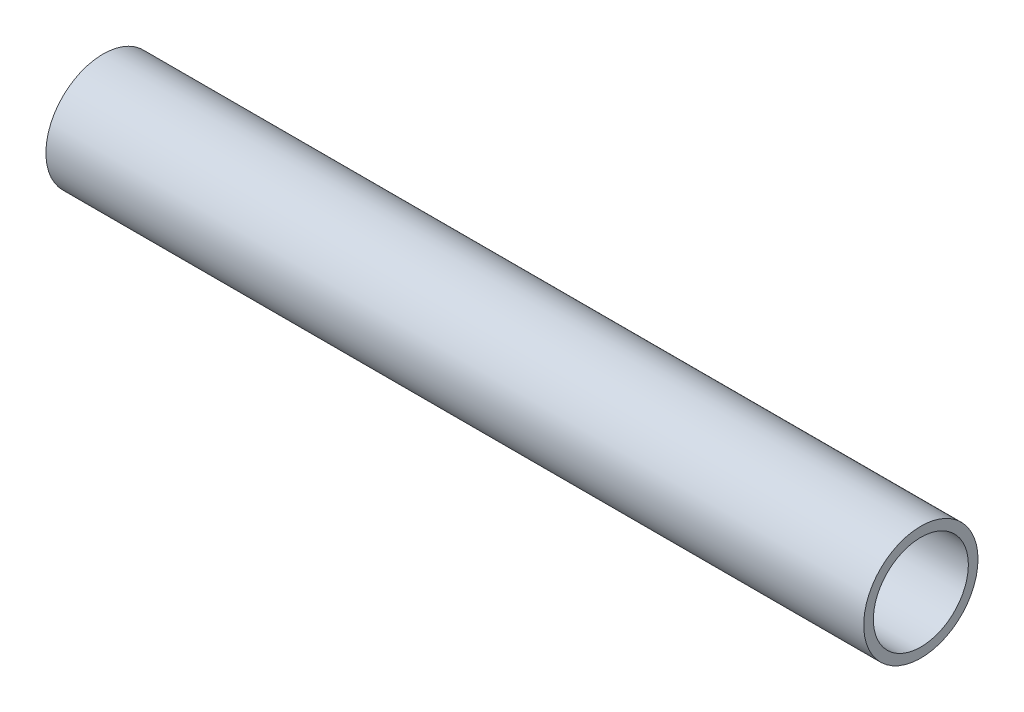
ISO-10303-21;
HEADER;
FILE_DESCRIPTION(('STEP AP214'),'2;1');
FILE_NAME('part.step','',(''),(''),'','','');
FILE_SCHEMA(('AUTOMOTIVE_DESIGN { 1 0 10303 214 1 1 1 1 }'));
ENDSEC;
DATA;
#1=APPLICATION_CONTEXT('core data for automotive mechanical design processes');
#2=APPLICATION_PROTOCOL_DEFINITION('international standard','automotive_design',2000,#1);
#3=PRODUCT_CONTEXT('',#1,'mechanical');
#4=PRODUCT('Part','Part','',(#3));
#5=PRODUCT_RELATED_PRODUCT_CATEGORY('part','',(#4));
#6=PRODUCT_DEFINITION_FORMATION('','',#4);
#7=PRODUCT_DEFINITION_CONTEXT('part definition',#1,'design');
#8=PRODUCT_DEFINITION('design','',#6,#7);
#9=PRODUCT_DEFINITION_SHAPE('','',#8);
#10=(LENGTH_UNIT() NAMED_UNIT(*) SI_UNIT(.MILLI.,.METRE.));
#11=(NAMED_UNIT(*) PLANE_ANGLE_UNIT() SI_UNIT($,.RADIAN.));
#12=(NAMED_UNIT(*) SI_UNIT($,.STERADIAN.) SOLID_ANGLE_UNIT());
#13=UNCERTAINTY_MEASURE_WITH_UNIT(LENGTH_MEASURE(1.E-05),#10,'distance_accuracy_value','');
#14=(GEOMETRIC_REPRESENTATION_CONTEXT(3) GLOBAL_UNCERTAINTY_ASSIGNED_CONTEXT((#13)) GLOBAL_UNIT_ASSIGNED_CONTEXT((#10,
#11,#12)) REPRESENTATION_CONTEXT('',''));
#15=CARTESIAN_POINT('',(0.,0.,0.));
#16=DIRECTION('',(0.,0.,1.));
#17=DIRECTION('',(1.,0.,0.));
#18=AXIS2_PLACEMENT_3D('',#15,#16,#17);
#19=CARTESIAN_POINT('',(-174.625,0.,0.));
#20=DIRECTION('',(1.,0.,0.));
#21=DIRECTION('',(0.,0.,-1.));
#22=AXIS2_PLACEMENT_3D('',#19,#20,#21);
#23=CYLINDRICAL_SURFACE('',#22,21.082);
#24=CARTESIAN_POINT('',(-95.25,0.,-21.082));
#25=CARTESIAN_POINT('',(-95.2500073037573,-0.177265588906064,-21.0819971511082));
#26=CARTESIAN_POINT('',(-95.2648956722781,-0.354633825443564,-21.0797407978607));
#27=CARTESIAN_POINT('',(-95.3240403602155,-0.704412011201185,-21.0709569196678));
#28=CARTESIAN_POINT('',(-95.3683252199961,-0.876816971803983,-21.064425243998));
#29=CARTESIAN_POINT('',(-95.4849091388346,-1.21155604974819,-21.0478246855302));
#30=CARTESIAN_POINT('',(-95.5571869641717,-1.37389769247853,-21.0377584843423));
#31=CARTESIAN_POINT('',(-95.7276530975323,-1.68412370373539,-21.0152009969064));
#32=CARTESIAN_POINT('',(-95.8258378289602,-1.83201006403648,-21.0027100454717));
#33=CARTESIAN_POINT('',(-96.0461542058056,-2.1103164343508,-20.9765819826565));
#34=CARTESIAN_POINT('',(-96.1684495601003,-2.24060616148058,-20.9629374218632));
#35=CARTESIAN_POINT('',(-96.4331633864275,-2.47889671955908,-20.9360982303561));
#36=CARTESIAN_POINT('',(-96.5755830188655,-2.58689626432783,-20.9229036256421));
#37=CARTESIAN_POINT('',(-96.8773786544134,-2.77804840978028,-20.8983859912104));
#38=CARTESIAN_POINT('',(-97.0368354067939,-2.86107486347092,-20.8870725883659));
#39=CARTESIAN_POINT('',(-97.3676295731584,-2.99911783525677,-20.8677000439257));
#40=CARTESIAN_POINT('',(-97.5389663337644,-3.05413589237424,-20.8596407235276));
#41=CARTESIAN_POINT('',(-97.8872863628436,-3.13419550245968,-20.8477621012251));
#42=CARTESIAN_POINT('',(-98.0642172558634,-3.15946016290709,-20.8439112577396));
#43=CARTESIAN_POINT('',(-98.419845943067,-3.17998699422211,-20.8407898425614));
#44=CARTESIAN_POINT('',(-98.5985436343971,-3.17525090142445,-20.8415190057945));
#45=CARTESIAN_POINT('',(-98.9510567099515,-3.13609297404926,-20.8474463775802));
#46=CARTESIAN_POINT('',(-99.1249004248299,-3.101919701057,-20.852607165254));
#47=CARTESIAN_POINT('',(-99.4643579756068,-3.00524659900985,-20.8667578327125));
#48=CARTESIAN_POINT('',(-99.6299715768266,-2.94274596272441,-20.8757478216156));
#49=CARTESIAN_POINT('',(-99.9490235812398,-2.7909340011809,-20.8965852461813));
#50=CARTESIAN_POINT('',(-100.102411162019,-2.70151746318004,-20.9084438587404));
#51=CARTESIAN_POINT('',(-100.392099144084,-2.498486828096,-20.9336742925736));
#52=CARTESIAN_POINT('',(-100.528398414064,-2.38487113028628,-20.9470462139227));
#53=CARTESIAN_POINT('',(-100.781481243325,-2.1353032656861,-20.9739618878806));
#54=CARTESIAN_POINT('',(-100.898054144489,-1.9991374095518,-20.9875060134767));
#55=CARTESIAN_POINT('',(-101.106725455512,-1.70906259522473,-21.0131148002247));
#56=CARTESIAN_POINT('',(-101.198823756631,-1.55515355820368,-21.0251794548033));
#57=CARTESIAN_POINT('',(-101.355942659601,-1.23377816277264,-21.0464826923882));
#58=CARTESIAN_POINT('',(-101.420946926471,-1.06630369822491,-21.0557195696406));
#59=CARTESIAN_POINT('',(-101.521848958346,-0.722645240857131,-21.070312259879));
#60=CARTESIAN_POINT('',(-101.557748707077,-0.546461842495156,-21.0756683373726));
#61=CARTESIAN_POINT('',(-101.599142333219,-0.192204765370484,-21.0818608911754));
#62=CARTESIAN_POINT('',(-101.604925808796,-0.0141656498471117,-21.0827404122035));
#63=CARTESIAN_POINT('',(-101.586691518388,0.340339952440575,-21.0799979514801));
#64=CARTESIAN_POINT('',(-101.562674682621,0.516806488119838,-21.0763761102388));
#65=CARTESIAN_POINT('',(-101.485762333879,0.862279899383912,-21.0650645063623));
#66=CARTESIAN_POINT('',(-101.433007989693,1.03131891039134,-21.0573946347692));
#67=CARTESIAN_POINT('',(-101.300267051749,1.35815274399449,-21.0388441665934));
#68=CARTESIAN_POINT('',(-101.220279170212,1.51594703443953,-21.0279634181826));
#69=CARTESIAN_POINT('',(-101.034662860785,1.8170851157619,-21.0040933283749));
#70=CARTESIAN_POINT('',(-100.928850826916,1.9603145348408,-20.9910891189132));
#71=CARTESIAN_POINT('',(-100.694845351182,2.22708618632573,-20.9644655933992));
#72=CARTESIAN_POINT('',(-100.566650597521,2.35062726403486,-20.9508462413297));
#73=CARTESIAN_POINT('',(-100.290229093112,2.57556977848285,-20.9243908347895));
#74=CARTESIAN_POINT('',(-100.141843493739,2.67677703259561,-20.9115622997957));
#75=CARTESIAN_POINT('',(-99.8300080053974,2.85282903090451,-20.888274456038));
#76=CARTESIAN_POINT('',(-99.6665585261644,2.92767449187153,-20.8778150828597));
#77=CARTESIAN_POINT('',(-99.3298127983176,3.04857772519442,-20.8605043047131));
#78=CARTESIAN_POINT('',(-99.156553855138,3.09473749350593,-20.8536401303661));
#79=CARTESIAN_POINT('',(-98.8046316089195,3.15728352894343,-20.8442630448294));
#80=CARTESIAN_POINT('',(-98.6259686832474,3.17367187018762,-20.8417498305174));
#81=CARTESIAN_POINT('',(-98.2702456638402,3.17616021106898,-20.8413705974415));
#82=CARTESIAN_POINT('',(-98.0931876803551,3.16256554437416,-20.8434577306442));
#83=CARTESIAN_POINT('',(-97.7439067922048,3.10612829026899,-20.8519421795031));
#84=CARTESIAN_POINT('',(-97.5716838795403,3.0632857512491,-20.8583394880282));
#85=CARTESIAN_POINT('',(-97.2370476835853,2.94967717748468,-20.874707044174));
#86=CARTESIAN_POINT('',(-97.0746269537971,2.87893265513937,-20.8846745386426));
#87=CARTESIAN_POINT('',(-96.7639105714977,2.71155871536682,-20.9070627102117));
#88=CARTESIAN_POINT('',(-96.6156154052644,2.61492840724794,-20.9194834717215));
#89=CARTESIAN_POINT('',(-96.3358087193127,2.39741725845485,-20.9455292166376));
#90=CARTESIAN_POINT('',(-96.2044739082908,2.27631033164997,-20.9591647100844));
#91=CARTESIAN_POINT('',(-95.9638828183518,2.01376149306829,-20.9860159394496));
#92=CARTESIAN_POINT('',(-95.8546316769312,1.87231486257537,-20.9992315770924));
#93=CARTESIAN_POINT('',(-95.6607669697578,1.57217776718591,-21.0238378848768));
#94=CARTESIAN_POINT('',(-95.5762935254673,1.41339594518084,-21.0352180180234));
#95=CARTESIAN_POINT('',(-95.4353412780308,1.08380087043067,-21.0547677779054));
#96=CARTESIAN_POINT('',(-95.3788335193363,0.913000272113382,-21.0629407235248));
#97=CARTESIAN_POINT('',(-95.3082168635909,0.61786433248082,-21.0732924950954));
#98=CARTESIAN_POINT('',(-95.2864189599853,0.495349503289427,-21.0765410154751));
#99=CARTESIAN_POINT('',(-95.2573080583054,0.248573261637359,-21.0808957533839));
#100=CARTESIAN_POINT('',(-95.2499948780599,0.124311871162614,-21.0820019978558));
#101=CARTESIAN_POINT('',(-95.25,0.,-21.082));
#102=B_SPLINE_CURVE_WITH_KNOTS('',3,(#24,#25,#26,#27,#28,#29,#30,#31,#32,#33,#34,#35,#36,#37,
#38,#39,#40,#41,#42,#43,#44,#45,#46,#47,#48,#49,#50,#51,#52,#53,#54,#55,#56,#57,#58,#59,#60,#61,
#62,#63,#64,#65,#66,#67,#68,#69,#70,#71,#72,#73,#74,#75,#76,#77,#78,#79,#80,#81,#82,#83,#84,#85,
#86,#87,#88,#89,#90,#91,#92,#93,#94,#95,#96,#97,#98,#99,#100,#101),.UNSPECIFIED.,.T.,.F.,(4,2,2,
2,2,2,2,2,2,2,2,2,2,2,2,2,2,2,2,2,2,2,2,2,2,2,2,2,2,2,2,2,2,2,2,2,2,2,4),(0.,0.531342512429038,
1.06320164882558,1.5946581376531,2.12604129424767,2.66116512439551,3.19631982343617,
3.73413403476704,4.27191869076775,4.80564452954641,5.33933947849273,5.86857170164552,
6.39781900700991,6.92916258470441,7.46054132064733,7.99727852314497,8.53401811031673,
9.07108083107699,9.6081069432693,10.1399593459211,10.6717951472021,11.2010416383702,
11.730313159249,12.2634633412738,12.7966447804,13.3342937698578,13.8719281396386,
14.4076397711918,14.9433140793118,15.4735585288678,16.0038021011393,16.5336376528597,
17.0634914377811,17.5984835709691,18.1336000206727,18.6716867332597,19.2092151415009,
19.5818368843675,19.9544539408189),.UNSPECIFIED.);
#103=CARTESIAN_POINT('',(-95.25,0.,-21.082));
#104=VERTEX_POINT('',#103);
#105=EDGE_CURVE('E78',#104,#104,#102,.T.);
#106=ORIENTED_EDGE('',*,*,#105,.F.);
#107=EDGE_LOOP('',(#106));
#108=FACE_BOUND('',#107,.T.);
#109=CARTESIAN_POINT('',(-146.05,0.,-21.082));
#110=CARTESIAN_POINT('',(-146.050007303757,-0.177265588906064,-21.0819971511082));
#111=CARTESIAN_POINT('',(-146.064895672278,-0.354633825443566,-21.0797407978607));
#112=CARTESIAN_POINT('',(-146.124040360215,-0.704412011201187,-21.0709569196678));
#113=CARTESIAN_POINT('',(-146.168325219996,-0.876816971803985,-21.064425243998));
#114=CARTESIAN_POINT('',(-146.284909138835,-1.21155604974819,-21.0478246855302));
#115=CARTESIAN_POINT('',(-146.357186964172,-1.37389769247854,-21.0377584843423));
#116=CARTESIAN_POINT('',(-146.527653097532,-1.6841237037354,-21.0152009969064));
#117=CARTESIAN_POINT('',(-146.62583782896,-1.8320100640365,-21.0027100454717));
#118=CARTESIAN_POINT('',(-146.846154205806,-2.11031643435081,-20.9765819826565));
#119=CARTESIAN_POINT('',(-146.9684495601,-2.24060616148059,-20.9629374218632));
#120=CARTESIAN_POINT('',(-147.233163386427,-2.47889671955909,-20.9360982303561));
#121=CARTESIAN_POINT('',(-147.375583018865,-2.58689626432784,-20.9229036256421));
#122=CARTESIAN_POINT('',(-147.677378654413,-2.77804840978029,-20.8983859912104));
#123=CARTESIAN_POINT('',(-147.836835406794,-2.86107486347093,-20.8870725883659));
#124=CARTESIAN_POINT('',(-148.167629573158,-2.99911783525678,-20.8677000439257));
#125=CARTESIAN_POINT('',(-148.338966333764,-3.05413589237425,-20.8596407235276));
#126=CARTESIAN_POINT('',(-148.687286362844,-3.13419550245969,-20.8477621012251));
#127=CARTESIAN_POINT('',(-148.864217255863,-3.15946016290709,-20.8439112577396));
#128=CARTESIAN_POINT('',(-149.219845943067,-3.17998699422211,-20.8407898425614));
#129=CARTESIAN_POINT('',(-149.398543634397,-3.17525090142445,-20.8415190057945));
#130=CARTESIAN_POINT('',(-149.751056709951,-3.13609297404926,-20.8474463775802));
#131=CARTESIAN_POINT('',(-149.92490042483,-3.101919701057,-20.852607165254));
#132=CARTESIAN_POINT('',(-150.264357975607,-3.00524659900985,-20.8667578327125));
#133=CARTESIAN_POINT('',(-150.429971576827,-2.9427459627244,-20.8757478216156));
#134=CARTESIAN_POINT('',(-150.74902358124,-2.79093400118089,-20.8965852461813));
#135=CARTESIAN_POINT('',(-150.902411162019,-2.70151746318001,-20.9084438587404));
#136=CARTESIAN_POINT('',(-151.192099144084,-2.49848682809597,-20.9336742925736));
#137=CARTESIAN_POINT('',(-151.328398414064,-2.38487113028625,-20.9470462139227));
#138=CARTESIAN_POINT('',(-151.581481243325,-2.13530326568607,-20.9739618878807));
#139=CARTESIAN_POINT('',(-151.698054144489,-1.99913740955177,-20.9875060134767));
#140=CARTESIAN_POINT('',(-151.906725455512,-1.70906259522471,-21.0131148002247));
#141=CARTESIAN_POINT('',(-151.998823756631,-1.55515355820366,-21.0251794548033));
#142=CARTESIAN_POINT('',(-152.155942659601,-1.23377816277263,-21.0464826923882));
#143=CARTESIAN_POINT('',(-152.220946926471,-1.0663036982249,-21.0557195696406));
#144=CARTESIAN_POINT('',(-152.321848958346,-0.722645240857127,-21.070312259879));
#145=CARTESIAN_POINT('',(-152.357748707077,-0.546461842495151,-21.0756683373726));
#146=CARTESIAN_POINT('',(-152.399142333219,-0.192204765370476,-21.0818608911754));
#147=CARTESIAN_POINT('',(-152.404925808796,-0.014165649847103,-21.0827404122035));
#148=CARTESIAN_POINT('',(-152.386691518388,0.340339952440583,-21.0799979514801));
#149=CARTESIAN_POINT('',(-152.362674682621,0.516806488119846,-21.0763761102388));
#150=CARTESIAN_POINT('',(-152.285762333879,0.86227989938392,-21.0650645063623));
#151=CARTESIAN_POINT('',(-152.233007989693,1.03131891039135,-21.0573946347692));
#152=CARTESIAN_POINT('',(-152.100267051749,1.3581527439945,-21.0388441665934));
#153=CARTESIAN_POINT('',(-152.020279170212,1.51594703443955,-21.0279634181826));
#154=CARTESIAN_POINT('',(-151.834662860785,1.8170851157619,-21.0040933283749));
#155=CARTESIAN_POINT('',(-151.728850826916,1.96031453484078,-20.9910891189132));
#156=CARTESIAN_POINT('',(-151.494845351182,2.22708618632572,-20.9644655933992));
#157=CARTESIAN_POINT('',(-151.366650597521,2.35062726403487,-20.9508462413297));
#158=CARTESIAN_POINT('',(-151.090229093112,2.57556977848286,-20.9243908347895));
#159=CARTESIAN_POINT('',(-150.941843493739,2.67677703259561,-20.9115622997957));
#160=CARTESIAN_POINT('',(-150.630008005397,2.8528290309045,-20.888274456038));
#161=CARTESIAN_POINT('',(-150.466558526164,2.92767449187153,-20.8778150828597));
#162=CARTESIAN_POINT('',(-150.129812798318,3.04857772519442,-20.8605043047131));
#163=CARTESIAN_POINT('',(-149.956553855138,3.09473749350594,-20.8536401303661));
#164=CARTESIAN_POINT('',(-149.604631608919,3.15728352894343,-20.8442630448294));
#165=CARTESIAN_POINT('',(-149.425968683247,3.17367187018762,-20.8417498305174));
#166=CARTESIAN_POINT('',(-149.07024566384,3.17616021106899,-20.8413705974415));
#167=CARTESIAN_POINT('',(-148.893187680355,3.16256554437416,-20.8434577306442));
#168=CARTESIAN_POINT('',(-148.543906792205,3.10612829026899,-20.8519421795031));
#169=CARTESIAN_POINT('',(-148.37168387954,3.0632857512491,-20.8583394880282));
#170=CARTESIAN_POINT('',(-148.037047683585,2.94967717748468,-20.874707044174));
#171=CARTESIAN_POINT('',(-147.874626953797,2.87893265513936,-20.8846745386426));
#172=CARTESIAN_POINT('',(-147.563910571498,2.71155871536682,-20.9070627102117));
#173=CARTESIAN_POINT('',(-147.415615405264,2.61492840724794,-20.9194834717215));
#174=CARTESIAN_POINT('',(-147.135808719313,2.39741725845485,-20.9455292166376));
#175=CARTESIAN_POINT('',(-147.004473908291,2.27631033164997,-20.9591647100844));
#176=CARTESIAN_POINT('',(-146.763882818352,2.01376149306828,-20.9860159394496));
#177=CARTESIAN_POINT('',(-146.654631676931,1.87231486257536,-20.9992315770924));
#178=CARTESIAN_POINT('',(-146.460766969758,1.57217776718591,-21.0238378848768));
#179=CARTESIAN_POINT('',(-146.376293525467,1.41339594518084,-21.0352180180234));
#180=CARTESIAN_POINT('',(-146.235341278031,1.08380087043067,-21.0547677779054));
#181=CARTESIAN_POINT('',(-146.178833519336,0.913000272113373,-21.0629407235248));
#182=CARTESIAN_POINT('',(-146.108216863591,0.617864332480807,-21.0732924950954));
#183=CARTESIAN_POINT('',(-146.086418959985,0.495349503289417,-21.0765410154751));
#184=CARTESIAN_POINT('',(-146.057308058305,0.248573261637354,-21.0808957533839));
#185=CARTESIAN_POINT('',(-146.04999487806,0.124311871162612,-21.0820019978558));
#186=CARTESIAN_POINT('',(-146.05,0.,-21.082));
#187=B_SPLINE_CURVE_WITH_KNOTS('',3,(#109,#110,#111,#112,#113,#114,#115,#116,#117,#118,#119,
#120,#121,#122,#123,#124,#125,#126,#127,#128,#129,#130,#131,#132,#133,#134,#135,#136,#137,#138,
#139,#140,#141,#142,#143,#144,#145,#146,#147,#148,#149,#150,#151,#152,#153,#154,#155,#156,#157,
#158,#159,#160,#161,#162,#163,#164,#165,#166,#167,#168,#169,#170,#171,#172,#173,#174,#175,#176,
#177,#178,#179,#180,#181,#182,#183,#184,#185,#186),.UNSPECIFIED.,.T.,.F.,(4,2,2,2,2,2,2,2,2,2,2,
2,2,2,2,2,2,2,2,2,2,2,2,2,2,2,2,2,2,2,2,2,2,2,2,2,2,2,4),(0.,0.53134251242904,1.06320164882559,
1.59465813765311,2.12604129424768,2.66116512439553,3.19631982343618,3.73413403476707,
4.27191869076778,4.80564452954643,5.33933947849274,5.86857170164554,6.39781900700992,
6.92916258470446,7.46054132064736,7.99727852314501,8.53401811031675,9.071080831077,
9.60810694326931,10.1399593459211,10.6717951472021,11.2010416383702,11.730313159249,
12.2634633412738,12.7966447804,13.3342937698578,13.8719281396386,14.4076397711918,
14.9433140793118,15.4735585288678,16.0038021011393,16.5336376528597,17.0634914377811,
17.5984835709691,18.1336000206728,18.6716867332597,19.2092151415009,19.5818368843675,
19.9544539408189),.UNSPECIFIED.);
#188=CARTESIAN_POINT('',(-146.05,0.,-21.082));
#189=VERTEX_POINT('',#188);
#190=EDGE_CURVE('E60',#189,#189,#187,.T.);
#191=ORIENTED_EDGE('',*,*,#190,.F.);
#192=EDGE_LOOP('',(#191));
#193=FACE_BOUND('',#192,.T.);
#194=CARTESIAN_POINT('',(-174.625,0.,0.));
#195=DIRECTION('',(1.,0.,0.));
#196=DIRECTION('',(0.,0.,-1.));
#197=AXIS2_PLACEMENT_3D('',#194,#195,#196);
#198=CIRCLE('',#197,21.082);
#199=CARTESIAN_POINT('',(-174.625,0.,-21.082));
#200=VERTEX_POINT('',#199);
#201=EDGE_CURVE('E10',#200,#200,#198,.T.);
#202=ORIENTED_EDGE('',*,*,#201,.T.);
#203=EDGE_LOOP('',(#202));
#204=FACE_BOUND('',#203,.T.);
#205=CARTESIAN_POINT('',(127.,0.,0.));
#206=DIRECTION('',(1.,0.,0.));
#207=DIRECTION('',(0.,0.,-1.));
#208=AXIS2_PLACEMENT_3D('',#205,#206,#207);
#209=CIRCLE('',#208,21.082);
#210=CARTESIAN_POINT('',(127.,0.,-21.082));
#211=VERTEX_POINT('',#210);
#212=EDGE_CURVE('E51',#211,#211,#209,.T.);
#213=ORIENTED_EDGE('',*,*,#212,.F.);
#214=EDGE_LOOP('',(#213));
#215=FACE_BOUND('',#214,.T.);
#216=ADVANCED_FACE('F33',(#108,#193,#204,#215),#23,.T.);
#217=CARTESIAN_POINT('',(-174.625,0.,0.));
#218=DIRECTION('',(1.,0.,0.));
#219=DIRECTION('',(0.,0.,-1.));
#220=AXIS2_PLACEMENT_3D('',#217,#218,#219);
#221=PLANE('',#220);
#222=CARTESIAN_POINT('',(-174.625,0.,0.));
#223=DIRECTION('',(1.,0.,0.));
#224=DIRECTION('',(0.,0.,-1.));
#225=AXIS2_PLACEMENT_3D('',#222,#223,#224);
#226=CIRCLE('',#225,17.526);
#227=CARTESIAN_POINT('',(-174.625,0.,-17.526));
#228=VERTEX_POINT('',#227);
#229=EDGE_CURVE('E46',#228,#228,#226,.T.);
#230=ORIENTED_EDGE('',*,*,#229,.T.);
#231=EDGE_LOOP('',(#230));
#232=FACE_BOUND('',#231,.T.);
#233=ORIENTED_EDGE('',*,*,#201,.F.);
#234=EDGE_LOOP('',(#233));
#235=FACE_BOUND('',#234,.T.);
#236=ADVANCED_FACE('F92',(#232,#235),#221,.F.);
#237=CARTESIAN_POINT('',(-174.625,0.,0.));
#238=DIRECTION('',(1.,0.,0.));
#239=DIRECTION('',(0.,0.,-1.));
#240=AXIS2_PLACEMENT_3D('',#237,#238,#239);
#241=CYLINDRICAL_SURFACE('',#240,17.526);
#242=CARTESIAN_POINT('',(-101.6,0.,-17.526));
#243=CARTESIAN_POINT('',(-101.599993132515,0.17679082350801,-17.5259968412274));
#244=CARTESIAN_POINT('',(-101.585183965731,0.353672270747988,-17.5232972774411));
#245=CARTESIAN_POINT('',(-101.526372438004,0.702458155041369,-17.5127883009458));
#246=CARTESIAN_POINT('',(-101.482344740396,0.874358137310072,-17.5049744534986));
#247=CARTESIAN_POINT('',(-101.366482418544,1.20808580036967,-17.485111731742));
#248=CARTESIAN_POINT('',(-101.29467216344,1.36992216434489,-17.4730665697294));
#249=CARTESIAN_POINT('',(-101.125350679922,1.67923272236702,-17.4460593997375));
#250=CARTESIAN_POINT('',(-101.027841801324,1.82670822784651,-17.4310976584752));
#251=CARTESIAN_POINT('',(-100.808729501993,2.10478127681952,-17.3997234174553));
#252=CARTESIAN_POINT('',(-100.686893953305,2.23519445696564,-17.3832978577657));
#253=CARTESIAN_POINT('',(-100.423086238519,2.47384671567764,-17.3509451203049));
#254=CARTESIAN_POINT('',(-100.281112684689,2.58208426483874,-17.3350179769725));
#255=CARTESIAN_POINT('',(-99.97976755925,2.77407084888639,-17.3053386524232));
#256=CARTESIAN_POINT('',(-99.82027574471,2.8576339824516,-17.2916033234658));
#257=CARTESIAN_POINT('',(-99.4892275026837,2.99671002667021,-17.2680459841376));
#258=CARTESIAN_POINT('',(-99.3176720447767,3.05222518866685,-17.2582236596927));
#259=CARTESIAN_POINT('',(-98.9693334205962,3.13304110203761,-17.2437354838221));
#260=CARTESIAN_POINT('',(-98.7926269370351,3.15866238598856,-17.2390149702052));
#261=CARTESIAN_POINT('',(-98.4373650062532,3.17995782064228,-17.235099927382));
#262=CARTESIAN_POINT('',(-98.2588097149559,3.1756344765814,-17.2359049358977));
#263=CARTESIAN_POINT('',(-97.9072300510038,3.13742365897766,-17.2429001682717));
#264=CARTESIAN_POINT('',(-97.7341647086679,3.10389926153133,-17.2490242538492));
#265=CARTESIAN_POINT('',(-97.3961562140921,3.00880912932249,-17.2658638407267));
#266=CARTESIAN_POINT('',(-97.231213386391,2.94724227511612,-17.2765795253205));
#267=CARTESIAN_POINT('',(-96.9130619363625,2.79745571266688,-17.3014647929721));
#268=CARTESIAN_POINT('',(-96.7599245079335,2.7090880872545,-17.3156534578234));
#269=CARTESIAN_POINT('',(-96.470514150003,2.50831315208051,-17.3458731721502));
#270=CARTESIAN_POINT('',(-96.3342428236547,2.39590355985285,-17.3619043964854));
#271=CARTESIAN_POINT('',(-96.0803338962992,2.14827149301383,-17.3942918762038));
#272=CARTESIAN_POINT('',(-95.962999429291,2.01273815664841,-17.4106494468318));
#273=CARTESIAN_POINT('',(-95.7526886211131,1.72374960651158,-17.4416297211863));
#274=CARTESIAN_POINT('',(-95.6597124943575,1.57029423499867,-17.4562524096409));
#275=CARTESIAN_POINT('',(-95.500718396598,1.24951132270804,-17.4821419521182));
#276=CARTESIAN_POINT('',(-95.4347304486683,1.08216858038397,-17.4934050650234));
#277=CARTESIAN_POINT('',(-95.3318843483637,0.738524824278316,-17.5112771866033));
#278=CARTESIAN_POINT('',(-95.2950233103667,0.562224699752744,-17.5178866563105));
#279=CARTESIAN_POINT('',(-95.2518958271967,0.208280155645573,-17.5256438790602));
#280=CARTESIAN_POINT('',(-95.245213792981,0.0306879466818638,-17.5268658171028));
#281=CARTESIAN_POINT('',(-95.2615213711922,-0.323076767936696,-17.5239146703191));
#282=CARTESIAN_POINT('',(-95.2845096264779,-0.499249338156001,-17.5197418322538));
#283=CARTESIAN_POINT('',(-95.3591596423848,-0.843866600411555,-17.5065161011469));
#284=CARTESIAN_POINT('',(-95.4106125479722,-1.01235801735561,-17.4974987676082));
#285=CARTESIAN_POINT('',(-95.5405063595171,-1.33832313012139,-17.4755909179164));
#286=CARTESIAN_POINT('',(-95.6189490011885,-1.49579611656221,-17.4627001526692));
#287=CARTESIAN_POINT('',(-95.8015255027009,-1.7970379428255,-17.4342904171948));
#288=CARTESIAN_POINT('',(-95.9059150975122,-1.94064931955918,-17.4187457992515));
#289=CARTESIAN_POINT('',(-96.1370744185283,-2.20846506883692,-17.3868220571775));
#290=CARTESIAN_POINT('',(-96.2638460863583,-2.33266775593063,-17.3704428607355));
#291=CARTESIAN_POINT('',(-96.5380470534088,-2.55970748627499,-17.3384518393717));
#292=CARTESIAN_POINT('',(-96.6857120955064,-2.66226178053651,-17.3228519867864));
#293=CARTESIAN_POINT('',(-96.9964178334415,-2.84110984177048,-17.2944212278246));
#294=CARTESIAN_POINT('',(-97.1594579820262,-2.91740454296296,-17.2815902229488));
#295=CARTESIAN_POINT('',(-97.4955450343434,-3.04115979533501,-17.2602426012819));
#296=CARTESIAN_POINT('',(-97.6685416025097,-3.08875345587471,-17.2517060985603));
#297=CARTESIAN_POINT('',(-98.0202437321866,-3.15416897697809,-17.2398671271274));
#298=CARTESIAN_POINT('',(-98.1989486950753,-3.17199394891527,-17.2365641114227));
#299=CARTESIAN_POINT('',(-98.5541655418571,-3.17726742876193,-17.2355925385196));
#300=CARTESIAN_POINT('',(-98.7306707384355,-3.16516161695717,-17.2378413124165));
#301=CARTESIAN_POINT('',(-99.0790866320758,-3.11188910689162,-17.2475373034534));
#302=CARTESIAN_POINT('',(-99.2509973523558,-3.07072255551699,-17.2549844943182));
#303=CARTESIAN_POINT('',(-99.5851258972035,-2.96067981082377,-17.2742044563146));
#304=CARTESIAN_POINT('',(-99.7473590229442,-2.89184876708741,-17.2859701767276));
#305=CARTESIAN_POINT('',(-100.058046204287,-2.72847862049299,-17.3125070165183));
#306=CARTESIAN_POINT('',(-100.20649937582,-2.633937869728,-17.3272783285292));
#307=CARTESIAN_POINT('',(-100.487651300551,-2.42026944589855,-17.3584203635157));
#308=CARTESIAN_POINT('',(-100.620100559389,-2.30081626698696,-17.37481057328));
#309=CARTESIAN_POINT('',(-100.86322420719,-2.04139533634304,-17.4071948659678));
#310=CARTESIAN_POINT('',(-100.973893583025,-1.90142287454245,-17.4231888569539));
#311=CARTESIAN_POINT('',(-101.171171023297,-1.60354404533997,-17.4531342301883));
#312=CARTESIAN_POINT('',(-101.257571193469,-1.44549813095465,-17.4670675069251));
#313=CARTESIAN_POINT('',(-101.402456942508,-1.11693687333548,-17.4911451342375));
#314=CARTESIAN_POINT('',(-101.460969245347,-0.946433648982045,-17.5012931100993));
#315=CARTESIAN_POINT('',(-101.536276479759,-0.646146664812306,-17.5145413811557));
#316=CARTESIAN_POINT('',(-101.560132786512,-0.518138865968811,-17.5188145120769));
#317=CARTESIAN_POINT('',(-101.591996893811,-0.26010370060993,-17.5245449517082));
#318=CARTESIAN_POINT('',(-101.600005052851,-0.130076379844328,-17.5260023241122));
#319=CARTESIAN_POINT('',(-101.6,0.,-17.526));
#320=B_SPLINE_CURVE_WITH_KNOTS('',3,(#242,#243,#244,#245,#246,#247,#248,#249,#250,#251,#252,
#253,#254,#255,#256,#257,#258,#259,#260,#261,#262,#263,#264,#265,#266,#267,#268,#269,#270,#271,
#272,#273,#274,#275,#276,#277,#278,#279,#280,#281,#282,#283,#284,#285,#286,#287,#288,#289,#290,
#291,#292,#293,#294,#295,#296,#297,#298,#299,#300,#301,#302,#303,#304,#305,#306,#307,#308,#309,
#310,#311,#312,#313,#314,#315,#316,#317,#318,#319),.UNSPECIFIED.,.T.,.F.,(4,2,2,2,2,2,2,2,2,2,2,
2,2,2,2,2,2,2,2,2,2,2,2,2,2,2,2,2,2,2,2,2,2,2,2,2,2,2,4),(0.,0.52989684739867,1.06025379298761,
1.59014659312776,2.11999095802632,2.65515610450925,3.19035814774705,3.7294952286848,
4.26858902750702,4.80184775131232,5.33506186200683,5.86173930617047,6.38843777693352,
6.91809776769747,7.4478080649945,7.985299753981,8.52279617407827,9.06088891772033,
9.59892834547637,10.1295354893394,10.6601183636945,11.1868588327276,11.713633182854,
12.2458209999474,12.778055006572,13.3168607871052,13.8556473969222,14.3919156166157,
14.9281277829441,15.4564037756751,15.9846770982784,16.5120917356115,17.0395401864443,
17.5743685624972,18.1093198977251,18.6487229234539,19.1876080135939,19.5774960261897,
19.9673752191978),.UNSPECIFIED.);
#321=CARTESIAN_POINT('',(-101.6,0.,-17.526));
#322=VERTEX_POINT('',#321);
#323=EDGE_CURVE('E37',#322,#322,#320,.T.);
#324=ORIENTED_EDGE('',*,*,#323,.T.);
#325=EDGE_LOOP('',(#324));
#326=FACE_BOUND('',#325,.T.);
#327=CARTESIAN_POINT('',(-152.4,0.,-17.526));
#328=CARTESIAN_POINT('',(-152.399993132515,0.176790823508009,-17.5259968412274));
#329=CARTESIAN_POINT('',(-152.385183965731,0.353672270747985,-17.5232972774411));
#330=CARTESIAN_POINT('',(-152.326372438004,0.702458155041367,-17.5127883009458));
#331=CARTESIAN_POINT('',(-152.282344740396,0.874358137310074,-17.5049744534986));
#332=CARTESIAN_POINT('',(-152.166482418544,1.20808580036968,-17.485111731742));
#333=CARTESIAN_POINT('',(-152.09467216344,1.3699221643449,-17.4730665697294));
#334=CARTESIAN_POINT('',(-151.925350679922,1.67923272236704,-17.4460593997375));
#335=CARTESIAN_POINT('',(-151.827841801324,1.82670822784652,-17.4310976584752));
#336=CARTESIAN_POINT('',(-151.608729501993,2.10478127681953,-17.3997234174553));
#337=CARTESIAN_POINT('',(-151.486893953305,2.23519445696565,-17.3832978577657));
#338=CARTESIAN_POINT('',(-151.223086238519,2.47384671567765,-17.3509451203049));
#339=CARTESIAN_POINT('',(-151.081112684689,2.58208426483874,-17.3350179769725));
#340=CARTESIAN_POINT('',(-150.77976755925,2.77407084888639,-17.3053386524232));
#341=CARTESIAN_POINT('',(-150.62027574471,2.8576339824516,-17.2916033234658));
#342=CARTESIAN_POINT('',(-150.289227502684,2.99671002667021,-17.2680459841376));
#343=CARTESIAN_POINT('',(-150.117672044777,3.05222518866685,-17.2582236596927));
#344=CARTESIAN_POINT('',(-149.769333420596,3.13304110203761,-17.2437354838221));
#345=CARTESIAN_POINT('',(-149.592626937035,3.15866238598857,-17.2390149702052));
#346=CARTESIAN_POINT('',(-149.237365006253,3.17995782064228,-17.235099927382));
#347=CARTESIAN_POINT('',(-149.058809714956,3.1756344765814,-17.2359049358977));
#348=CARTESIAN_POINT('',(-148.707230051004,3.13742365897766,-17.2429001682717));
#349=CARTESIAN_POINT('',(-148.534164708668,3.10389926153133,-17.2490242538492));
#350=CARTESIAN_POINT('',(-148.196156214092,3.00880912932248,-17.2658638407267));
#351=CARTESIAN_POINT('',(-148.031213386391,2.94724227511611,-17.2765795253205));
#352=CARTESIAN_POINT('',(-147.713061936362,2.79745571266685,-17.3014647929721));
#353=CARTESIAN_POINT('',(-147.559924507933,2.70908808725447,-17.3156534578234));
#354=CARTESIAN_POINT('',(-147.270514150003,2.50831315208049,-17.3458731721502));
#355=CARTESIAN_POINT('',(-147.134242823655,2.39590355985283,-17.3619043964854));
#356=CARTESIAN_POINT('',(-146.880333896299,2.14827149301382,-17.3942918762038));
#357=CARTESIAN_POINT('',(-146.762999429291,2.01273815664841,-17.4106494468318));
#358=CARTESIAN_POINT('',(-146.552688621113,1.72374960651158,-17.4416297211863));
#359=CARTESIAN_POINT('',(-146.459712494357,1.57029423499867,-17.4562524096409));
#360=CARTESIAN_POINT('',(-146.300718396598,1.24951132270804,-17.4821419521182));
#361=CARTESIAN_POINT('',(-146.234730448668,1.08216858038396,-17.4934050650234));
#362=CARTESIAN_POINT('',(-146.131884348364,0.738524824278307,-17.5112771866033));
#363=CARTESIAN_POINT('',(-146.095023310367,0.562224699752732,-17.5178866563105));
#364=CARTESIAN_POINT('',(-146.051895827197,0.208280155645558,-17.5256438790602));
#365=CARTESIAN_POINT('',(-146.045213792981,0.0306879466818504,-17.5268658171028));
#366=CARTESIAN_POINT('',(-146.061521371192,-0.323076767936705,-17.5239146703191));
#367=CARTESIAN_POINT('',(-146.084509626478,-0.499249338156009,-17.5197418322538));
#368=CARTESIAN_POINT('',(-146.159159642385,-0.843866600411558,-17.5065161011469));
#369=CARTESIAN_POINT('',(-146.210612547972,-1.01235801735561,-17.4974987676082));
#370=CARTESIAN_POINT('',(-146.340506359517,-1.3383231301214,-17.4755909179164));
#371=CARTESIAN_POINT('',(-146.418949001188,-1.49579611656221,-17.4627001526692));
#372=CARTESIAN_POINT('',(-146.601525502701,-1.79703794282551,-17.4342904171948));
#373=CARTESIAN_POINT('',(-146.705915097512,-1.94064931955918,-17.4187457992515));
#374=CARTESIAN_POINT('',(-146.937074418528,-2.20846506883692,-17.3868220571775));
#375=CARTESIAN_POINT('',(-147.063846086358,-2.33266775593063,-17.3704428607355));
#376=CARTESIAN_POINT('',(-147.338047053409,-2.559707486275,-17.3384518393717));
#377=CARTESIAN_POINT('',(-147.485712095506,-2.66226178053653,-17.3228519867864));
#378=CARTESIAN_POINT('',(-147.796417833441,-2.84110984177049,-17.2944212278246));
#379=CARTESIAN_POINT('',(-147.959457982026,-2.91740454296297,-17.2815902229488));
#380=CARTESIAN_POINT('',(-148.295545034343,-3.04115979533501,-17.2602426012819));
#381=CARTESIAN_POINT('',(-148.46854160251,-3.08875345587471,-17.2517060985603));
#382=CARTESIAN_POINT('',(-148.820243732187,-3.1541689769781,-17.2398671271274));
#383=CARTESIAN_POINT('',(-148.998948695075,-3.17199394891528,-17.2365641114227));
#384=CARTESIAN_POINT('',(-149.354165541857,-3.17726742876193,-17.2355925385196));
#385=CARTESIAN_POINT('',(-149.530670738435,-3.16516161695717,-17.2378413124165));
#386=CARTESIAN_POINT('',(-149.879086632076,-3.11188910689162,-17.2475373034534));
#387=CARTESIAN_POINT('',(-150.050997352356,-3.07072255551698,-17.2549844943182));
#388=CARTESIAN_POINT('',(-150.385125897204,-2.96067981082376,-17.2742044563146));
#389=CARTESIAN_POINT('',(-150.547359022944,-2.8918487670874,-17.2859701767276));
#390=CARTESIAN_POINT('',(-150.858046204287,-2.72847862049297,-17.3125070165183));
#391=CARTESIAN_POINT('',(-151.00649937582,-2.63393786972798,-17.3272783285293));
#392=CARTESIAN_POINT('',(-151.287651300551,-2.42026944589853,-17.3584203635157));
#393=CARTESIAN_POINT('',(-151.420100559389,-2.30081626698695,-17.37481057328));
#394=CARTESIAN_POINT('',(-151.66322420719,-2.04139533634303,-17.4071948659678));
#395=CARTESIAN_POINT('',(-151.773893583025,-1.90142287454244,-17.4231888569539));
#396=CARTESIAN_POINT('',(-151.971171023297,-1.60354404533996,-17.4531342301883));
#397=CARTESIAN_POINT('',(-152.057571193469,-1.44549813095464,-17.4670675069251));
#398=CARTESIAN_POINT('',(-152.202456942508,-1.11693687333546,-17.4911451342375));
#399=CARTESIAN_POINT('',(-152.260969245347,-0.946433648982028,-17.5012931100993));
#400=CARTESIAN_POINT('',(-152.336276479759,-0.646146664812287,-17.5145413811557));
#401=CARTESIAN_POINT('',(-152.360132786512,-0.518138865968793,-17.5188145120769));
#402=CARTESIAN_POINT('',(-152.391996893811,-0.260103700609919,-17.5245449517082));
#403=CARTESIAN_POINT('',(-152.400005052851,-0.130076379844322,-17.5260023241122));
#404=CARTESIAN_POINT('',(-152.4,0.,-17.526));
#405=B_SPLINE_CURVE_WITH_KNOTS('',3,(#327,#328,#329,#330,#331,#332,#333,#334,#335,#336,#337,
#338,#339,#340,#341,#342,#343,#344,#345,#346,#347,#348,#349,#350,#351,#352,#353,#354,#355,#356,
#357,#358,#359,#360,#361,#362,#363,#364,#365,#366,#367,#368,#369,#370,#371,#372,#373,#374,#375,
#376,#377,#378,#379,#380,#381,#382,#383,#384,#385,#386,#387,#388,#389,#390,#391,#392,#393,#394,
#395,#396,#397,#398,#399,#400,#401,#402,#403,#404),.UNSPECIFIED.,.T.,.F.,(4,2,2,2,2,2,2,2,2,2,2,
2,2,2,2,2,2,2,2,2,2,2,2,2,2,2,2,2,2,2,2,2,2,2,2,2,2,2,4),(0.,0.52989684739867,1.06025379298762,
1.59014659312777,2.11999095802633,2.65515610450925,3.19035814774706,3.72949522868482,
4.26858902750703,4.80184775131235,5.33506186200683,5.86173930617047,6.3884377769336,
6.91809776769754,7.44780806499452,7.985299753981,8.52279617407827,9.06088891772035,
9.59892834547639,10.1295354893394,10.6601183636946,11.1868588327276,11.713633182854,
12.2458209999474,12.778055006572,13.3168607871052,13.8556473969223,14.3919156166158,
14.9281277829441,15.4564037756751,15.9846770982785,16.5120917356116,17.0395401864443,
17.5743685624972,18.1093198977252,18.648722923454,19.1876080135939,19.5774960261897,
19.9673752191978),.UNSPECIFIED.);
#406=CARTESIAN_POINT('',(-152.4,0.,-17.526));
#407=VERTEX_POINT('',#406);
#408=EDGE_CURVE('E54',#407,#407,#405,.T.);
#409=ORIENTED_EDGE('',*,*,#408,.T.);
#410=EDGE_LOOP('',(#409));
#411=FACE_BOUND('',#410,.T.);
#412=ORIENTED_EDGE('',*,*,#229,.F.);
#413=EDGE_LOOP('',(#412));
#414=FACE_BOUND('',#413,.T.);
#415=CARTESIAN_POINT('',(127.,0.,0.));
#416=DIRECTION('',(1.,0.,0.));
#417=DIRECTION('',(0.,0.,-1.));
#418=AXIS2_PLACEMENT_3D('',#415,#416,#417);
#419=CIRCLE('',#418,17.526);
#420=CARTESIAN_POINT('',(127.,0.,-17.526));
#421=VERTEX_POINT('',#420);
#422=EDGE_CURVE('E84',#421,#421,#419,.T.);
#423=ORIENTED_EDGE('',*,*,#422,.T.);
#424=EDGE_LOOP('',(#423));
#425=FACE_BOUND('',#424,.T.);
#426=ADVANCED_FACE('F61',(#326,#411,#414,#425),#241,.F.);
#427=CARTESIAN_POINT('',(127.,0.,0.));
#428=DIRECTION('',(1.,0.,0.));
#429=DIRECTION('',(0.,0.,-1.));
#430=AXIS2_PLACEMENT_3D('',#427,#428,#429);
#431=PLANE('',#430);
#432=ORIENTED_EDGE('',*,*,#212,.T.);
#433=EDGE_LOOP('',(#432));
#434=FACE_BOUND('',#433,.T.);
#435=ORIENTED_EDGE('',*,*,#422,.F.);
#436=EDGE_LOOP('',(#435));
#437=FACE_BOUND('',#436,.T.);
#438=ADVANCED_FACE('F68',(#434,#437),#431,.T.);
#439=CARTESIAN_POINT('',(-149.225,0.,-21.082));
#440=DIRECTION('',(0.,0.,1.));
#441=DIRECTION('',(1.,0.,0.));
#442=AXIS2_PLACEMENT_3D('',#439,#440,#441);
#443=CYLINDRICAL_SURFACE('',#442,3.17500000000009);
#444=ORIENTED_EDGE('',*,*,#190,.T.);
#445=EDGE_LOOP('',(#444));
#446=FACE_BOUND('',#445,.T.);
#447=ORIENTED_EDGE('',*,*,#408,.F.);
#448=EDGE_LOOP('',(#447));
#449=FACE_BOUND('',#448,.T.);
#450=ADVANCED_FACE('F64',(#446,#449),#443,.F.);
#451=CARTESIAN_POINT('',(-98.4250000000001,0.,-21.082));
#452=DIRECTION('',(0.,0.,1.));
#453=DIRECTION('',(1.,0.,0.));
#454=AXIS2_PLACEMENT_3D('',#451,#452,#453);
#455=CYLINDRICAL_SURFACE('',#454,3.17500000000008);
#456=ORIENTED_EDGE('',*,*,#105,.T.);
#457=EDGE_LOOP('',(#456));
#458=FACE_BOUND('',#457,.T.);
#459=ORIENTED_EDGE('',*,*,#323,.F.);
#460=EDGE_LOOP('',(#459));
#461=FACE_BOUND('',#460,.T.);
#462=ADVANCED_FACE('F67',(#458,#461),#455,.F.);
#463=CLOSED_SHELL('',(#216,#236,#426,#438,#450,#462));
#464=MANIFOLD_SOLID_BREP('B2',#463);
#465=ADVANCED_BREP_SHAPE_REPRESENTATION('',(#18,#464),#14);
#466=SHAPE_DEFINITION_REPRESENTATION(#9,#465);
ENDSEC;
END-ISO-10303-21;
